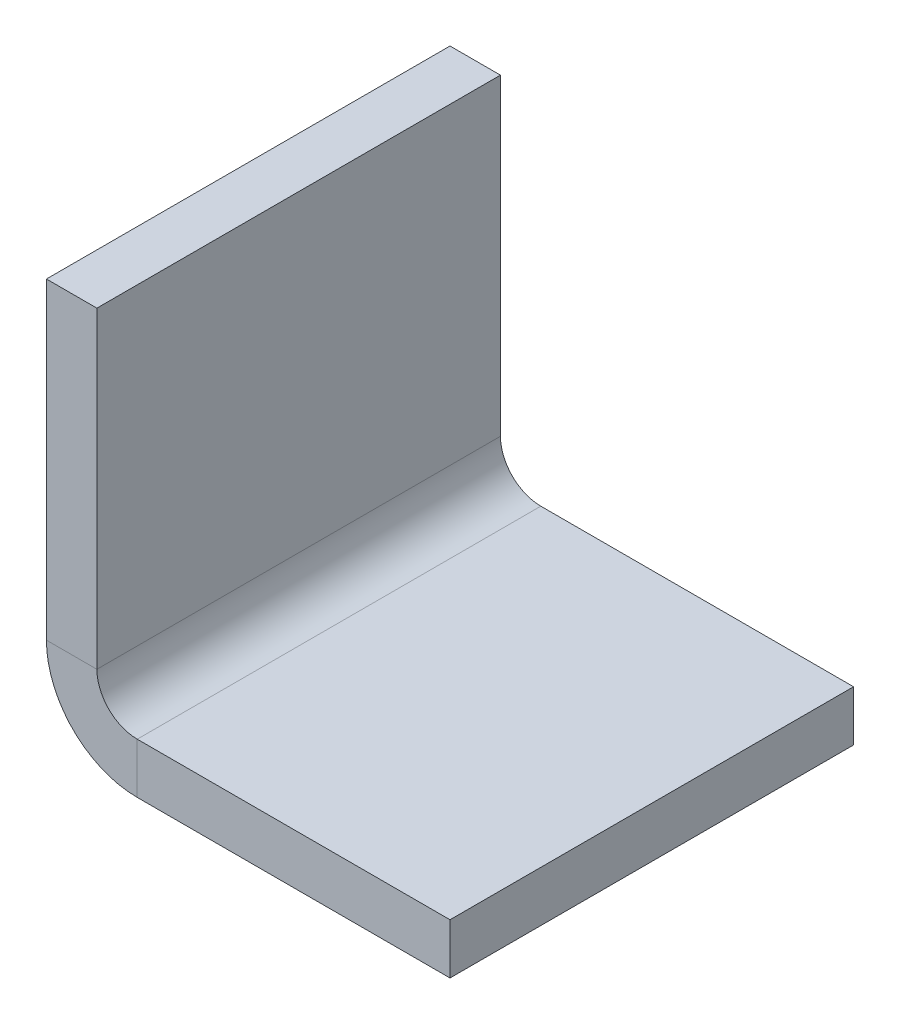
ISO-10303-21;
HEADER;
FILE_DESCRIPTION(('STEP AP214'),'2;1');
FILE_NAME('part.step','',(''),(''),'','','');
FILE_SCHEMA(('AUTOMOTIVE_DESIGN { 1 0 10303 214 1 1 1 1 }'));
ENDSEC;
DATA;
#1=APPLICATION_CONTEXT('core data for automotive mechanical design processes');
#2=APPLICATION_PROTOCOL_DEFINITION('international standard','automotive_design',2000,#1);
#3=PRODUCT_CONTEXT('',#1,'mechanical');
#4=PRODUCT('Part','Part','',(#3));
#5=PRODUCT_RELATED_PRODUCT_CATEGORY('part','',(#4));
#6=PRODUCT_DEFINITION_FORMATION('','',#4);
#7=PRODUCT_DEFINITION_CONTEXT('part definition',#1,'design');
#8=PRODUCT_DEFINITION('design','',#6,#7);
#9=PRODUCT_DEFINITION_SHAPE('','',#8);
#10=(LENGTH_UNIT() NAMED_UNIT(*) SI_UNIT(.MILLI.,.METRE.));
#11=(NAMED_UNIT(*) PLANE_ANGLE_UNIT() SI_UNIT($,.RADIAN.));
#12=(NAMED_UNIT(*) SI_UNIT($,.STERADIAN.) SOLID_ANGLE_UNIT());
#13=UNCERTAINTY_MEASURE_WITH_UNIT(LENGTH_MEASURE(1.E-05),#10,'distance_accuracy_value','');
#14=(GEOMETRIC_REPRESENTATION_CONTEXT(3) GLOBAL_UNCERTAINTY_ASSIGNED_CONTEXT((#13)) GLOBAL_UNIT_ASSIGNED_CONTEXT((#10,
#11,#12)) REPRESENTATION_CONTEXT('',''));
#15=CARTESIAN_POINT('',(0.,0.,0.));
#16=DIRECTION('',(0.,0.,1.));
#17=DIRECTION('',(1.,0.,0.));
#18=AXIS2_PLACEMENT_3D('',#15,#16,#17);
#19=CARTESIAN_POINT('',(0.,2.8575,12.7));
#20=DIRECTION('',(0.,0.,1.));
#21=DIRECTION('',(1.,0.,0.));
#22=AXIS2_PLACEMENT_3D('',#19,#20,#21);
#23=PLANE('',#22);
#24=DIRECTION('',(1.,0.,0.));
#25=VECTOR('',#24,1.);
#26=CARTESIAN_POINT('',(0.,2.8575,12.7));
#27=LINE('',#26,#25);
#28=CARTESIAN_POINT('',(0.,2.8575,12.7));
#29=VERTEX_POINT('',#28);
#30=CARTESIAN_POINT('',(1.5875,2.8575,12.7));
#31=VERTEX_POINT('',#30);
#32=EDGE_CURVE('E11',#29,#31,#27,.T.);
#33=ORIENTED_EDGE('',*,*,#32,.F.);
#34=CARTESIAN_POINT('',(2.8575,2.8575,12.7));
#35=DIRECTION('',(0.,0.,1.));
#36=DIRECTION('',(1.,0.,0.));
#37=AXIS2_PLACEMENT_3D('',#34,#35,#36);
#38=CIRCLE('',#37,2.8575);
#39=CARTESIAN_POINT('',(2.8575,0.,12.7));
#40=VERTEX_POINT('',#39);
#41=EDGE_CURVE('E145',#40,#29,#38,.F.);
#42=ORIENTED_EDGE('',*,*,#41,.F.);
#43=DIRECTION('',(0.,-1.,0.));
#44=VECTOR('',#43,1.);
#45=CARTESIAN_POINT('',(2.8575,1.5875,12.7));
#46=LINE('',#45,#44);
#47=CARTESIAN_POINT('',(2.8575,1.5875,12.7));
#48=VERTEX_POINT('',#47);
#49=EDGE_CURVE('E51',#48,#40,#46,.T.);
#50=ORIENTED_EDGE('',*,*,#49,.F.);
#51=CARTESIAN_POINT('',(2.8575,2.8575,12.7));
#52=DIRECTION('',(0.,0.,1.));
#53=DIRECTION('',(1.,0.,0.));
#54=AXIS2_PLACEMENT_3D('',#51,#52,#53);
#55=CIRCLE('',#54,1.27);
#56=EDGE_CURVE('E135',#48,#31,#55,.F.);
#57=ORIENTED_EDGE('',*,*,#56,.T.);
#58=EDGE_LOOP('',(#33,#42,#50,#57));
#59=FACE_BOUND('',#58,.T.);
#60=ADVANCED_FACE('F42',(#59),#23,.T.);
#61=CARTESIAN_POINT('',(2.8575,1.5875,12.7));
#62=DIRECTION('',(0.,0.,1.));
#63=DIRECTION('',(1.,0.,0.));
#64=AXIS2_PLACEMENT_3D('',#61,#62,#63);
#65=PLANE('',#64);
#66=DIRECTION('',(0.,1.,0.));
#67=VECTOR('',#66,1.);
#68=CARTESIAN_POINT('',(0.,0.,12.7));
#69=LINE('',#68,#67);
#70=CARTESIAN_POINT('',(0.,12.7,12.7));
#71=VERTEX_POINT('',#70);
#72=EDGE_CURVE('E215',#29,#71,#69,.T.);
#73=ORIENTED_EDGE('',*,*,#72,.F.);
#74=ORIENTED_EDGE('',*,*,#32,.T.);
#75=DIRECTION('',(0.,1.,0.));
#76=VECTOR('',#75,1.);
#77=CARTESIAN_POINT('',(1.5875,0.,12.7));
#78=LINE('',#77,#76);
#79=CARTESIAN_POINT('',(1.5875,12.7,12.7));
#80=VERTEX_POINT('',#79);
#81=EDGE_CURVE('E99',#31,#80,#78,.T.);
#82=ORIENTED_EDGE('',*,*,#81,.T.);
#83=DIRECTION('',(1.,0.,0.));
#84=VECTOR('',#83,1.);
#85=CARTESIAN_POINT('',(0.,12.7,12.7));
#86=LINE('',#85,#84);
#87=EDGE_CURVE('E401',#71,#80,#86,.T.);
#88=ORIENTED_EDGE('',*,*,#87,.F.);
#89=EDGE_LOOP('',(#73,#74,#82,#88));
#90=FACE_BOUND('',#89,.T.);
#91=ADVANCED_FACE('F223',(#90),#65,.T.);
#92=CARTESIAN_POINT('',(2.8575,0.,0.));
#93=DIRECTION('',(0.,0.,-1.));
#94=DIRECTION('',(-1.,0.,0.));
#95=AXIS2_PLACEMENT_3D('',#92,#93,#94);
#96=PLANE('',#95);
#97=DIRECTION('',(0.,1.,0.));
#98=VECTOR('',#97,1.);
#99=CARTESIAN_POINT('',(2.8575,0.,0.));
#100=LINE('',#99,#98);
#101=CARTESIAN_POINT('',(2.8575,0.,0.));
#102=VERTEX_POINT('',#101);
#103=CARTESIAN_POINT('',(2.8575,1.5875,0.));
#104=VERTEX_POINT('',#103);
#105=EDGE_CURVE('E86',#102,#104,#100,.T.);
#106=ORIENTED_EDGE('',*,*,#105,.F.);
#107=CARTESIAN_POINT('',(2.8575,2.8575,0.));
#108=DIRECTION('',(0.,0.,1.));
#109=DIRECTION('',(1.,0.,0.));
#110=AXIS2_PLACEMENT_3D('',#107,#108,#109);
#111=CIRCLE('',#110,2.8575);
#112=CARTESIAN_POINT('',(0.,2.8575,0.));
#113=VERTEX_POINT('',#112);
#114=EDGE_CURVE('E164',#102,#113,#111,.F.);
#115=ORIENTED_EDGE('',*,*,#114,.T.);
#116=DIRECTION('',(-1.,0.,0.));
#117=VECTOR('',#116,1.);
#118=CARTESIAN_POINT('',(1.5875,2.8575,0.));
#119=LINE('',#118,#117);
#120=CARTESIAN_POINT('',(1.5875,2.8575,0.));
#121=VERTEX_POINT('',#120);
#122=EDGE_CURVE('E93',#121,#113,#119,.T.);
#123=ORIENTED_EDGE('',*,*,#122,.F.);
#124=CARTESIAN_POINT('',(2.8575,2.8575,0.));
#125=DIRECTION('',(0.,0.,1.));
#126=DIRECTION('',(1.,0.,0.));
#127=AXIS2_PLACEMENT_3D('',#124,#125,#126);
#128=CIRCLE('',#127,1.27);
#129=EDGE_CURVE('E175',#104,#121,#128,.F.);
#130=ORIENTED_EDGE('',*,*,#129,.F.);
#131=EDGE_LOOP('',(#106,#115,#123,#130));
#132=FACE_BOUND('',#131,.T.);
#133=ADVANCED_FACE('F221',(#132),#96,.T.);
#134=CARTESIAN_POINT('',(1.5875,2.8575,0.));
#135=DIRECTION('',(0.,0.,-1.));
#136=DIRECTION('',(-1.,0.,0.));
#137=AXIS2_PLACEMENT_3D('',#134,#135,#136);
#138=PLANE('',#137);
#139=DIRECTION('',(-1.,0.,0.));
#140=VECTOR('',#139,1.);
#141=CARTESIAN_POINT('',(12.7,0.,0.));
#142=LINE('',#141,#140);
#143=CARTESIAN_POINT('',(12.7,0.,0.));
#144=VERTEX_POINT('',#143);
#145=EDGE_CURVE('E167',#144,#102,#142,.T.);
#146=ORIENTED_EDGE('',*,*,#145,.T.);
#147=ORIENTED_EDGE('',*,*,#105,.T.);
#148=DIRECTION('',(-1.,0.,0.));
#149=VECTOR('',#148,1.);
#150=CARTESIAN_POINT('',(12.7,1.5875,0.));
#151=LINE('',#150,#149);
#152=CARTESIAN_POINT('',(12.7,1.5875,0.));
#153=VERTEX_POINT('',#152);
#154=EDGE_CURVE('E172',#153,#104,#151,.T.);
#155=ORIENTED_EDGE('',*,*,#154,.F.);
#156=DIRECTION('',(0.,-1.,0.));
#157=VECTOR('',#156,1.);
#158=CARTESIAN_POINT('',(12.7,1.5875,0.));
#159=LINE('',#158,#157);
#160=EDGE_CURVE('E121',#153,#144,#159,.T.);
#161=ORIENTED_EDGE('',*,*,#160,.T.);
#162=EDGE_LOOP('',(#146,#147,#155,#161));
#163=FACE_BOUND('',#162,.T.);
#164=ADVANCED_FACE('F217',(#163),#138,.T.);
#165=CARTESIAN_POINT('',(1.5875,0.,12.7));
#166=DIRECTION('',(-1.,0.,0.));
#167=DIRECTION('',(0.,0.,1.));
#168=AXIS2_PLACEMENT_3D('',#165,#166,#167);
#169=PLANE('',#168);
#170=DIRECTION('',(0.,1.,0.));
#171=VECTOR('',#170,1.);
#172=CARTESIAN_POINT('',(1.5875,0.,0.));
#173=LINE('',#172,#171);
#174=CARTESIAN_POINT('',(1.5875,12.7,0.));
#175=VERTEX_POINT('',#174);
#176=EDGE_CURVE('E152',#121,#175,#173,.T.);
#177=ORIENTED_EDGE('',*,*,#176,.T.);
#178=DIRECTION('',(0.,0.,-1.));
#179=VECTOR('',#178,1.);
#180=CARTESIAN_POINT('',(1.5875,12.7,12.7));
#181=LINE('',#180,#179);
#182=EDGE_CURVE('E196',#80,#175,#181,.T.);
#183=ORIENTED_EDGE('',*,*,#182,.F.);
#184=ORIENTED_EDGE('',*,*,#81,.F.);
#185=DIRECTION('',(0.,0.,-1.));
#186=VECTOR('',#185,1.);
#187=CARTESIAN_POINT('',(1.5875,2.8575,12.7));
#188=LINE('',#187,#186);
#189=EDGE_CURVE('E151',#31,#121,#188,.T.);
#190=ORIENTED_EDGE('',*,*,#189,.T.);
#191=EDGE_LOOP('',(#177,#183,#184,#190));
#192=FACE_BOUND('',#191,.T.);
#193=ADVANCED_FACE('F229',(#192),#169,.F.);
#194=CARTESIAN_POINT('',(0.,12.7,12.7));
#195=DIRECTION('',(0.,1.,0.));
#196=DIRECTION('',(0.,0.,1.));
#197=AXIS2_PLACEMENT_3D('',#194,#195,#196);
#198=PLANE('',#197);
#199=DIRECTION('',(1.,0.,0.));
#200=VECTOR('',#199,1.);
#201=CARTESIAN_POINT('',(0.,12.7,0.));
#202=LINE('',#201,#200);
#203=CARTESIAN_POINT('',(0.,12.7,0.));
#204=VERTEX_POINT('',#203);
#205=EDGE_CURVE('E156',#204,#175,#202,.T.);
#206=ORIENTED_EDGE('',*,*,#205,.F.);
#207=DIRECTION('',(0.,0.,-1.));
#208=VECTOR('',#207,1.);
#209=CARTESIAN_POINT('',(0.,12.7,12.7));
#210=LINE('',#209,#208);
#211=EDGE_CURVE('E193',#71,#204,#210,.T.);
#212=ORIENTED_EDGE('',*,*,#211,.F.);
#213=ORIENTED_EDGE('',*,*,#87,.T.);
#214=ORIENTED_EDGE('',*,*,#182,.T.);
#215=EDGE_LOOP('',(#206,#212,#213,#214));
#216=FACE_BOUND('',#215,.T.);
#217=ADVANCED_FACE('F257',(#216),#198,.T.);
#218=CARTESIAN_POINT('',(0.,0.,12.7));
#219=DIRECTION('',(-1.,0.,0.));
#220=DIRECTION('',(0.,0.,1.));
#221=AXIS2_PLACEMENT_3D('',#218,#219,#220);
#222=PLANE('',#221);
#223=DIRECTION('',(0.,1.,0.));
#224=VECTOR('',#223,1.);
#225=CARTESIAN_POINT('',(0.,0.,0.));
#226=LINE('',#225,#224);
#227=EDGE_CURVE('E160',#113,#204,#226,.T.);
#228=ORIENTED_EDGE('',*,*,#227,.F.);
#229=DIRECTION('',(0.,0.,-1.));
#230=VECTOR('',#229,1.);
#231=CARTESIAN_POINT('',(0.,2.8575,12.7));
#232=LINE('',#231,#230);
#233=EDGE_CURVE('E189',#29,#113,#232,.T.);
#234=ORIENTED_EDGE('',*,*,#233,.F.);
#235=ORIENTED_EDGE('',*,*,#72,.T.);
#236=ORIENTED_EDGE('',*,*,#211,.T.);
#237=EDGE_LOOP('',(#228,#234,#235,#236));
#238=FACE_BOUND('',#237,.T.);
#239=ADVANCED_FACE('F267',(#238),#222,.T.);
#240=CARTESIAN_POINT('',(2.8575,2.8575,12.7));
#241=DIRECTION('',(0.,0.,-1.));
#242=DIRECTION('',(-1.,0.,0.));
#243=AXIS2_PLACEMENT_3D('',#240,#241,#242);
#244=CYLINDRICAL_SURFACE('',#243,2.8575);
#245=ORIENTED_EDGE('',*,*,#114,.F.);
#246=DIRECTION('',(0.,0.,-1.));
#247=VECTOR('',#246,1.);
#248=CARTESIAN_POINT('',(2.8575,0.,12.7));
#249=LINE('',#248,#247);
#250=EDGE_CURVE('E185',#40,#102,#249,.T.);
#251=ORIENTED_EDGE('',*,*,#250,.F.);
#252=ORIENTED_EDGE('',*,*,#41,.T.);
#253=ORIENTED_EDGE('',*,*,#233,.T.);
#254=EDGE_LOOP('',(#245,#251,#252,#253));
#255=FACE_BOUND('',#254,.T.);
#256=ADVANCED_FACE('F210',(#255),#244,.T.);
#257=CARTESIAN_POINT('',(12.7,0.,12.7));
#258=DIRECTION('',(0.,-1.,0.));
#259=DIRECTION('',(1.,0.,0.));
#260=AXIS2_PLACEMENT_3D('',#257,#258,#259);
#261=PLANE('',#260);
#262=ORIENTED_EDGE('',*,*,#145,.F.);
#263=DIRECTION('',(0.,0.,-1.));
#264=VECTOR('',#263,1.);
#265=CARTESIAN_POINT('',(12.7,0.,12.7));
#266=LINE('',#265,#264);
#267=CARTESIAN_POINT('',(12.7,0.,12.7));
#268=VERTEX_POINT('',#267);
#269=EDGE_CURVE('E124',#268,#144,#266,.T.);
#270=ORIENTED_EDGE('',*,*,#269,.F.);
#271=DIRECTION('',(-1.,0.,0.));
#272=VECTOR('',#271,1.);
#273=CARTESIAN_POINT('',(12.7,0.,12.7));
#274=LINE('',#273,#272);
#275=EDGE_CURVE('E140',#268,#40,#274,.T.);
#276=ORIENTED_EDGE('',*,*,#275,.T.);
#277=ORIENTED_EDGE('',*,*,#250,.T.);
#278=EDGE_LOOP('',(#262,#270,#276,#277));
#279=FACE_BOUND('',#278,.T.);
#280=ADVANCED_FACE('F216',(#279),#261,.T.);
#281=CARTESIAN_POINT('',(12.7,1.5875,12.7));
#282=DIRECTION('',(1.,0.,0.));
#283=DIRECTION('',(0.,0.,-1.));
#284=AXIS2_PLACEMENT_3D('',#281,#282,#283);
#285=PLANE('',#284);
#286=ORIENTED_EDGE('',*,*,#160,.F.);
#287=DIRECTION('',(0.,0.,-1.));
#288=VECTOR('',#287,1.);
#289=CARTESIAN_POINT('',(12.7,1.5875,12.7));
#290=LINE('',#289,#288);
#291=CARTESIAN_POINT('',(12.7,1.5875,12.7));
#292=VERTEX_POINT('',#291);
#293=EDGE_CURVE('E115',#292,#153,#290,.T.);
#294=ORIENTED_EDGE('',*,*,#293,.F.);
#295=DIRECTION('',(0.,-1.,0.));
#296=VECTOR('',#295,1.);
#297=CARTESIAN_POINT('',(12.7,1.5875,12.7));
#298=LINE('',#297,#296);
#299=EDGE_CURVE('E119',#292,#268,#298,.T.);
#300=ORIENTED_EDGE('',*,*,#299,.T.);
#301=ORIENTED_EDGE('',*,*,#269,.T.);
#302=EDGE_LOOP('',(#286,#294,#300,#301));
#303=FACE_BOUND('',#302,.T.);
#304=ADVANCED_FACE('F117',(#303),#285,.T.);
#305=CARTESIAN_POINT('',(12.7,1.5875,12.7));
#306=DIRECTION('',(0.,-1.,0.));
#307=DIRECTION('',(1.,0.,0.));
#308=AXIS2_PLACEMENT_3D('',#305,#306,#307);
#309=PLANE('',#308);
#310=ORIENTED_EDGE('',*,*,#154,.T.);
#311=DIRECTION('',(0.,0.,-1.));
#312=VECTOR('',#311,1.);
#313=CARTESIAN_POINT('',(2.8575,1.5875,12.7));
#314=LINE('',#313,#312);
#315=EDGE_CURVE('E125',#48,#104,#314,.T.);
#316=ORIENTED_EDGE('',*,*,#315,.F.);
#317=DIRECTION('',(-1.,0.,0.));
#318=VECTOR('',#317,1.);
#319=CARTESIAN_POINT('',(12.7,1.5875,12.7));
#320=LINE('',#319,#318);
#321=EDGE_CURVE('E129',#292,#48,#320,.T.);
#322=ORIENTED_EDGE('',*,*,#321,.F.);
#323=ORIENTED_EDGE('',*,*,#293,.T.);
#324=EDGE_LOOP('',(#310,#316,#322,#323));
#325=FACE_BOUND('',#324,.T.);
#326=ADVANCED_FACE('F130',(#325),#309,.F.);
#327=CARTESIAN_POINT('',(2.8575,2.8575,12.7));
#328=DIRECTION('',(0.,0.,-1.));
#329=DIRECTION('',(-1.,0.,0.));
#330=AXIS2_PLACEMENT_3D('',#327,#328,#329);
#331=CYLINDRICAL_SURFACE('',#330,1.27);
#332=ORIENTED_EDGE('',*,*,#129,.T.);
#333=ORIENTED_EDGE('',*,*,#189,.F.);
#334=ORIENTED_EDGE('',*,*,#56,.F.);
#335=ORIENTED_EDGE('',*,*,#315,.T.);
#336=EDGE_LOOP('',(#332,#333,#334,#335));
#337=FACE_BOUND('',#336,.T.);
#338=ADVANCED_FACE('F219',(#337),#331,.F.);
#339=CARTESIAN_POINT('',(2.8575,2.8575,12.7));
#340=DIRECTION('',(0.,0.,1.));
#341=DIRECTION('',(1.,0.,0.));
#342=AXIS2_PLACEMENT_3D('',#339,#340,#341);
#343=PLANE('',#342);
#344=ORIENTED_EDGE('',*,*,#321,.T.);
#345=ORIENTED_EDGE('',*,*,#49,.T.);
#346=ORIENTED_EDGE('',*,*,#275,.F.);
#347=ORIENTED_EDGE('',*,*,#299,.F.);
#348=EDGE_LOOP('',(#344,#345,#346,#347));
#349=FACE_BOUND('',#348,.T.);
#350=ADVANCED_FACE('F138',(#349),#343,.T.);
#351=CARTESIAN_POINT('',(2.8575,2.8575,0.));
#352=DIRECTION('',(0.,0.,1.));
#353=DIRECTION('',(1.,0.,0.));
#354=AXIS2_PLACEMENT_3D('',#351,#352,#353);
#355=PLANE('',#354);
#356=ORIENTED_EDGE('',*,*,#176,.F.);
#357=ORIENTED_EDGE('',*,*,#122,.T.);
#358=ORIENTED_EDGE('',*,*,#227,.T.);
#359=ORIENTED_EDGE('',*,*,#205,.T.);
#360=EDGE_LOOP('',(#356,#357,#358,#359));
#361=FACE_BOUND('',#360,.T.);
#362=ADVANCED_FACE('F326',(#361),#355,.F.);
#363=CLOSED_SHELL('',(#60,#91,#133,#164,#193,#217,#239,#256,#280,#304,#326,#338,#350,#362));
#364=MANIFOLD_SOLID_BREP('B2',#363);
#365=ADVANCED_BREP_SHAPE_REPRESENTATION('',(#18,#364),#14);
#366=SHAPE_DEFINITION_REPRESENTATION(#9,#365);
ENDSEC;
END-ISO-10303-21;
